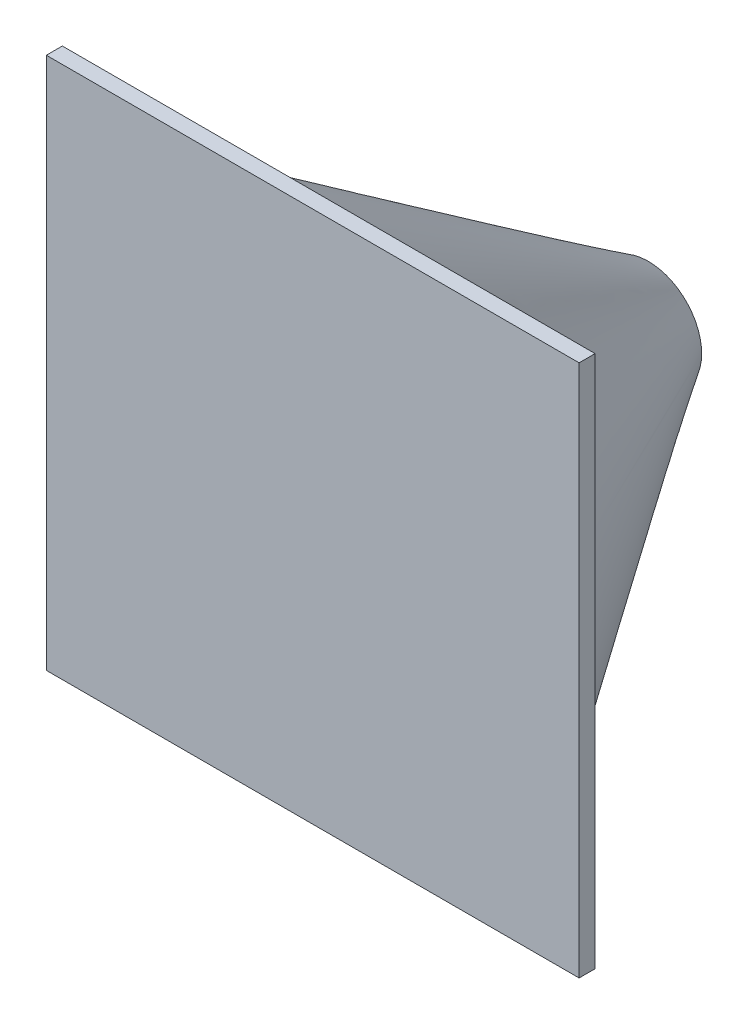
ISO-10303-21;
HEADER;
FILE_DESCRIPTION(('STEP AP214'),'2;1');
FILE_NAME('part.step','',(''),(''),'','','');
FILE_SCHEMA(('AUTOMOTIVE_DESIGN { 1 0 10303 214 1 1 1 1 }'));
ENDSEC;
DATA;
#1=APPLICATION_CONTEXT('core data for automotive mechanical design processes');
#2=APPLICATION_PROTOCOL_DEFINITION('international standard','automotive_design',2000,#1);
#3=PRODUCT_CONTEXT('',#1,'mechanical');
#4=PRODUCT('Part','Part','',(#3));
#5=PRODUCT_RELATED_PRODUCT_CATEGORY('part','',(#4));
#6=PRODUCT_DEFINITION_FORMATION('','',#4);
#7=PRODUCT_DEFINITION_CONTEXT('part definition',#1,'design');
#8=PRODUCT_DEFINITION('design','',#6,#7);
#9=PRODUCT_DEFINITION_SHAPE('','',#8);
#10=(LENGTH_UNIT() NAMED_UNIT(*) SI_UNIT(.MILLI.,.METRE.));
#11=(NAMED_UNIT(*) PLANE_ANGLE_UNIT() SI_UNIT($,.RADIAN.));
#12=(NAMED_UNIT(*) SI_UNIT($,.STERADIAN.) SOLID_ANGLE_UNIT());
#13=UNCERTAINTY_MEASURE_WITH_UNIT(LENGTH_MEASURE(1.E-05),#10,'distance_accuracy_value','');
#14=(GEOMETRIC_REPRESENTATION_CONTEXT(3) GLOBAL_UNCERTAINTY_ASSIGNED_CONTEXT((#13)) GLOBAL_UNIT_ASSIGNED_CONTEXT((#10,
#11,#12)) REPRESENTATION_CONTEXT('',''));
#15=CARTESIAN_POINT('',(0.,0.,0.));
#16=DIRECTION('',(0.,0.,1.));
#17=DIRECTION('',(1.,0.,0.));
#18=AXIS2_PLACEMENT_3D('',#15,#16,#17);
#19=CARTESIAN_POINT('',(0.,0.,0.));
#20=DIRECTION('',(0.,0.,1.));
#21=DIRECTION('',(1.,0.,0.));
#22=AXIS2_PLACEMENT_3D('',#19,#20,#21);
#23=PLANE('',#22);
#24=CARTESIAN_POINT('',(0.,0.,0.));
#25=DIRECTION('',(0.,0.,1.));
#26=DIRECTION('',(1.,0.,0.));
#27=AXIS2_PLACEMENT_3D('',#24,#25,#26);
#28=CIRCLE('',#27,50.);
#29=CARTESIAN_POINT('',(50.,0.,0.));
#30=VERTEX_POINT('',#29);
#31=EDGE_CURVE('E12',#30,#30,#28,.T.);
#32=ORIENTED_EDGE('',*,*,#31,.F.);
#33=EDGE_LOOP('',(#32));
#34=FACE_BOUND('',#33,.T.);
#35=ADVANCED_FACE('F43',(#34),#23,.F.);
#36=CARTESIAN_POINT('',(157.289403044734,194.319437241444,300.));
#37=CARTESIAN_POINT('',(42.3170970130029,26.6319976793349,0.));
#38=CARTESIAN_POINT('',(545.928277527621,-120.259368848024,300.));
#39=CARTESIAN_POINT('',(95.5810923716726,-58.0021963466709,0.));
#40=CARTESIAN_POINT('',(231.349471438153,-508.898243330911,300.));
#41=CARTESIAN_POINT('',(10.9468983456668,-111.266191705341,0.));
#42=CARTESIAN_POINT('',(-157.289403044734,-194.319437241444,300.));
#43=CARTESIAN_POINT('',(-42.3170970130029,-26.6319976793349,0.));
#44=CARTESIAN_POINT('',(-545.928277527621,120.259368848024,300.));
#45=CARTESIAN_POINT('',(-95.5810923716727,58.002196346671,0.));
#46=CARTESIAN_POINT('',(-231.349471438153,508.898243330911,300.));
#47=CARTESIAN_POINT('',(-10.9468983456668,111.266191705341,0.));
#48=CARTESIAN_POINT('',(157.289403044734,194.319437241444,300.));
#49=CARTESIAN_POINT('',(42.3170970130029,26.6319976793349,0.));
#50=(BOUNDED_SURFACE() B_SPLINE_SURFACE(3,1,((#36,#37),(#38,#39),(#40,#41),(#42,#43),(#44,#45),
(#46,#47),(#48,#49)),.UNSPECIFIED.,.T.,.F.,.F.) B_SPLINE_SURFACE_WITH_KNOTS((4,3,4),(2,2),(0.,
0.5,1.),(0.,1.),.UNSPECIFIED.) GEOMETRIC_REPRESENTATION_ITEM() RATIONAL_B_SPLINE_SURFACE(((1.,
1.),(0.333333333333333,0.333333333333334),(0.333333333333333,0.333333333333334),(1.,1.),
(0.333333333333333,0.333333333333333),(0.333333333333333,0.333333333333333),(1.,1.))) REPRESENTATION_ITEM('') SURFACE());
#51=CARTESIAN_POINT('',(0.,0.,300.));
#52=DIRECTION('',(0.,0.,1.));
#53=DIRECTION('',(1.,0.,0.));
#54=AXIS2_PLACEMENT_3D('',#51,#52,#53);
#55=CIRCLE('',#54,250.);
#56=CARTESIAN_POINT('',(250.,0.,300.));
#57=VERTEX_POINT('',#56);
#58=CARTESIAN_POINT('',(-0.00049983368950642,250.,300.));
#59=VERTEX_POINT('',#58);
#60=EDGE_CURVE('E47',#57,#59,#55,.T.);
#61=CARTESIAN_POINT('',(0.000499833689960928,-250.,300.));
#62=VERTEX_POINT('',#61);
#63=EDGE_CURVE('E60',#62,#57,#55,.T.);
#64=CARTESIAN_POINT('',(-250.,-0.000549789043169044,300.));
#65=VERTEX_POINT('',#64);
#66=EDGE_CURVE('E65',#65,#62,#55,.T.);
#67=EDGE_CURVE('E256',#59,#65,#55,.T.);
#68=ORIENTED_EDGE('',*,*,#60,.F.);
#69=ORIENTED_EDGE('',*,*,#63,.F.);
#70=ORIENTED_EDGE('',*,*,#66,.F.);
#71=ORIENTED_EDGE('',*,*,#67,.F.);
#72=EDGE_LOOP('',(#68,#69,#70,#71));
#73=FACE_BOUND('',#72,.T.);
#74=ORIENTED_EDGE('',*,*,#31,.T.);
#75=EDGE_LOOP('',(#74));
#76=FACE_BOUND('',#75,.T.);
#77=ADVANCED_FACE('F188',(#73,#76),#50,.T.);
#78=CARTESIAN_POINT('',(0.,0.,300.));
#79=DIRECTION('',(0.,0.,1.));
#80=DIRECTION('',(1.,0.,0.));
#81=AXIS2_PLACEMENT_3D('',#78,#79,#80);
#82=PLANE('',#81);
#83=DIRECTION('',(0.,1.,0.));
#84=VECTOR('',#83,1.);
#85=CARTESIAN_POINT('',(250.,-250.,300.));
#86=LINE('',#85,#84);
#87=CARTESIAN_POINT('',(250.,250.,300.));
#88=VERTEX_POINT('',#87);
#89=EDGE_CURVE('E140',#57,#88,#86,.T.);
#90=ORIENTED_EDGE('',*,*,#89,.F.);
#91=ORIENTED_EDGE('',*,*,#60,.T.);
#92=DIRECTION('',(-1.,0.,0.));
#93=VECTOR('',#92,1.);
#94=CARTESIAN_POINT('',(0.,250.,300.));
#95=LINE('',#94,#93);
#96=EDGE_CURVE('E137',#88,#59,#95,.T.);
#97=ORIENTED_EDGE('',*,*,#96,.F.);
#98=EDGE_LOOP('',(#90,#91,#97));
#99=FACE_BOUND('',#98,.T.);
#100=ADVANCED_FACE('F177',(#99),#82,.F.);
#101=CARTESIAN_POINT('',(-250.,250.,300.));
#102=VERTEX_POINT('',#101);
#103=EDGE_CURVE('E115',#59,#102,#95,.T.);
#104=ORIENTED_EDGE('',*,*,#103,.F.);
#105=ORIENTED_EDGE('',*,*,#67,.T.);
#106=DIRECTION('',(0.,-1.,0.));
#107=VECTOR('',#106,1.);
#108=CARTESIAN_POINT('',(-250.,250.,300.));
#109=LINE('',#108,#107);
#110=EDGE_CURVE('E165',#102,#65,#109,.T.);
#111=ORIENTED_EDGE('',*,*,#110,.F.);
#112=EDGE_LOOP('',(#104,#105,#111));
#113=FACE_BOUND('',#112,.T.);
#114=ADVANCED_FACE('F187',(#113),#82,.F.);
#115=CARTESIAN_POINT('',(-250.,-250.,300.));
#116=VERTEX_POINT('',#115);
#117=EDGE_CURVE('E139',#65,#116,#109,.T.);
#118=ORIENTED_EDGE('',*,*,#117,.F.);
#119=ORIENTED_EDGE('',*,*,#66,.T.);
#120=DIRECTION('',(1.,0.,0.));
#121=VECTOR('',#120,1.);
#122=CARTESIAN_POINT('',(-250.,-250.,300.));
#123=LINE('',#122,#121);
#124=EDGE_CURVE('E143',#116,#62,#123,.T.);
#125=ORIENTED_EDGE('',*,*,#124,.F.);
#126=EDGE_LOOP('',(#118,#119,#125));
#127=FACE_BOUND('',#126,.T.);
#128=ADVANCED_FACE('F160',(#127),#82,.F.);
#129=CARTESIAN_POINT('',(250.,-250.,300.));
#130=VERTEX_POINT('',#129);
#131=EDGE_CURVE('E163',#62,#130,#123,.T.);
#132=ORIENTED_EDGE('',*,*,#131,.F.);
#133=ORIENTED_EDGE('',*,*,#63,.T.);
#134=EDGE_CURVE('E108',#130,#57,#86,.T.);
#135=ORIENTED_EDGE('',*,*,#134,.F.);
#136=EDGE_LOOP('',(#132,#133,#135));
#137=FACE_BOUND('',#136,.T.);
#138=ADVANCED_FACE('F190',(#137),#82,.F.);
#139=CARTESIAN_POINT('',(0.,250.,315.));
#140=DIRECTION('',(0.,-1.,0.));
#141=DIRECTION('',(0.,0.,-1.));
#142=AXIS2_PLACEMENT_3D('',#139,#140,#141);
#143=PLANE('',#142);
#144=ORIENTED_EDGE('',*,*,#96,.T.);
#145=ORIENTED_EDGE('',*,*,#103,.T.);
#146=DIRECTION('',(0.,0.,-1.));
#147=VECTOR('',#146,1.);
#148=CARTESIAN_POINT('',(-250.,250.,315.));
#149=LINE('',#148,#147);
#150=CARTESIAN_POINT('',(-250.,250.,315.));
#151=VERTEX_POINT('',#150);
#152=EDGE_CURVE('E111',#151,#102,#149,.T.);
#153=ORIENTED_EDGE('',*,*,#152,.F.);
#154=DIRECTION('',(-1.,0.,0.));
#155=VECTOR('',#154,1.);
#156=CARTESIAN_POINT('',(250.,250.,315.));
#157=LINE('',#156,#155);
#158=CARTESIAN_POINT('',(250.,250.,315.));
#159=VERTEX_POINT('',#158);
#160=EDGE_CURVE('E97',#159,#151,#157,.T.);
#161=ORIENTED_EDGE('',*,*,#160,.F.);
#162=DIRECTION('',(0.,0.,-1.));
#163=VECTOR('',#162,1.);
#164=CARTESIAN_POINT('',(250.,250.,315.));
#165=LINE('',#164,#163);
#166=EDGE_CURVE('E129',#159,#88,#165,.T.);
#167=ORIENTED_EDGE('',*,*,#166,.T.);
#168=EDGE_LOOP('',(#144,#145,#153,#161,#167));
#169=FACE_BOUND('',#168,.T.);
#170=ADVANCED_FACE('F113',(#169),#143,.F.);
#171=CARTESIAN_POINT('',(-250.,250.,315.));
#172=DIRECTION('',(1.,0.,0.));
#173=DIRECTION('',(0.,0.,-1.));
#174=AXIS2_PLACEMENT_3D('',#171,#172,#173);
#175=PLANE('',#174);
#176=ORIENTED_EDGE('',*,*,#110,.T.);
#177=ORIENTED_EDGE('',*,*,#117,.T.);
#178=DIRECTION('',(0.,0.,-1.));
#179=VECTOR('',#178,1.);
#180=CARTESIAN_POINT('',(-250.,-250.,315.));
#181=LINE('',#180,#179);
#182=CARTESIAN_POINT('',(-250.,-250.,315.));
#183=VERTEX_POINT('',#182);
#184=EDGE_CURVE('E119',#183,#116,#181,.T.);
#185=ORIENTED_EDGE('',*,*,#184,.F.);
#186=DIRECTION('',(0.,-1.,0.));
#187=VECTOR('',#186,1.);
#188=CARTESIAN_POINT('',(-250.,250.,315.));
#189=LINE('',#188,#187);
#190=EDGE_CURVE('E101',#151,#183,#189,.T.);
#191=ORIENTED_EDGE('',*,*,#190,.F.);
#192=ORIENTED_EDGE('',*,*,#152,.T.);
#193=EDGE_LOOP('',(#176,#177,#185,#191,#192));
#194=FACE_BOUND('',#193,.T.);
#195=ADVANCED_FACE('F121',(#194),#175,.F.);
#196=CARTESIAN_POINT('',(-250.,-250.,315.));
#197=DIRECTION('',(0.,1.,0.));
#198=DIRECTION('',(0.,0.,1.));
#199=AXIS2_PLACEMENT_3D('',#196,#197,#198);
#200=PLANE('',#199);
#201=ORIENTED_EDGE('',*,*,#124,.T.);
#202=ORIENTED_EDGE('',*,*,#131,.T.);
#203=DIRECTION('',(0.,0.,-1.));
#204=VECTOR('',#203,1.);
#205=CARTESIAN_POINT('',(250.,-250.,315.));
#206=LINE('',#205,#204);
#207=CARTESIAN_POINT('',(250.,-250.,315.));
#208=VERTEX_POINT('',#207);
#209=EDGE_CURVE('E150',#208,#130,#206,.T.);
#210=ORIENTED_EDGE('',*,*,#209,.F.);
#211=DIRECTION('',(1.,0.,0.));
#212=VECTOR('',#211,1.);
#213=CARTESIAN_POINT('',(-250.,-250.,315.));
#214=LINE('',#213,#212);
#215=EDGE_CURVE('E124',#183,#208,#214,.T.);
#216=ORIENTED_EDGE('',*,*,#215,.F.);
#217=ORIENTED_EDGE('',*,*,#184,.T.);
#218=EDGE_LOOP('',(#201,#202,#210,#216,#217));
#219=FACE_BOUND('',#218,.T.);
#220=ADVANCED_FACE('F156',(#219),#200,.F.);
#221=CARTESIAN_POINT('',(250.,-250.,315.));
#222=DIRECTION('',(-1.,0.,0.));
#223=DIRECTION('',(0.,0.,1.));
#224=AXIS2_PLACEMENT_3D('',#221,#222,#223);
#225=PLANE('',#224);
#226=ORIENTED_EDGE('',*,*,#134,.T.);
#227=ORIENTED_EDGE('',*,*,#89,.T.);
#228=ORIENTED_EDGE('',*,*,#166,.F.);
#229=DIRECTION('',(0.,1.,0.));
#230=VECTOR('',#229,1.);
#231=CARTESIAN_POINT('',(250.,-250.,315.));
#232=LINE('',#231,#230);
#233=EDGE_CURVE('E104',#208,#159,#232,.T.);
#234=ORIENTED_EDGE('',*,*,#233,.F.);
#235=ORIENTED_EDGE('',*,*,#209,.T.);
#236=EDGE_LOOP('',(#226,#227,#228,#234,#235));
#237=FACE_BOUND('',#236,.T.);
#238=ADVANCED_FACE('F191',(#237),#225,.F.);
#239=CARTESIAN_POINT('',(0.,0.,315.));
#240=DIRECTION('',(0.,0.,1.));
#241=DIRECTION('',(1.,0.,0.));
#242=AXIS2_PLACEMENT_3D('',#239,#240,#241);
#243=PLANE('',#242);
#244=ORIENTED_EDGE('',*,*,#160,.T.);
#245=ORIENTED_EDGE('',*,*,#190,.T.);
#246=ORIENTED_EDGE('',*,*,#215,.T.);
#247=ORIENTED_EDGE('',*,*,#233,.T.);
#248=EDGE_LOOP('',(#244,#245,#246,#247));
#249=FACE_BOUND('',#248,.T.);
#250=ADVANCED_FACE('F99',(#249),#243,.T.);
#251=CLOSED_SHELL('',(#35,#77,#100,#114,#128,#138,#170,#195,#220,#238,#250));
#252=MANIFOLD_SOLID_BREP('B2',#251);
#253=ADVANCED_BREP_SHAPE_REPRESENTATION('',(#18,#252),#14);
#254=SHAPE_DEFINITION_REPRESENTATION(#9,#253);
ENDSEC;
END-ISO-10303-21;
